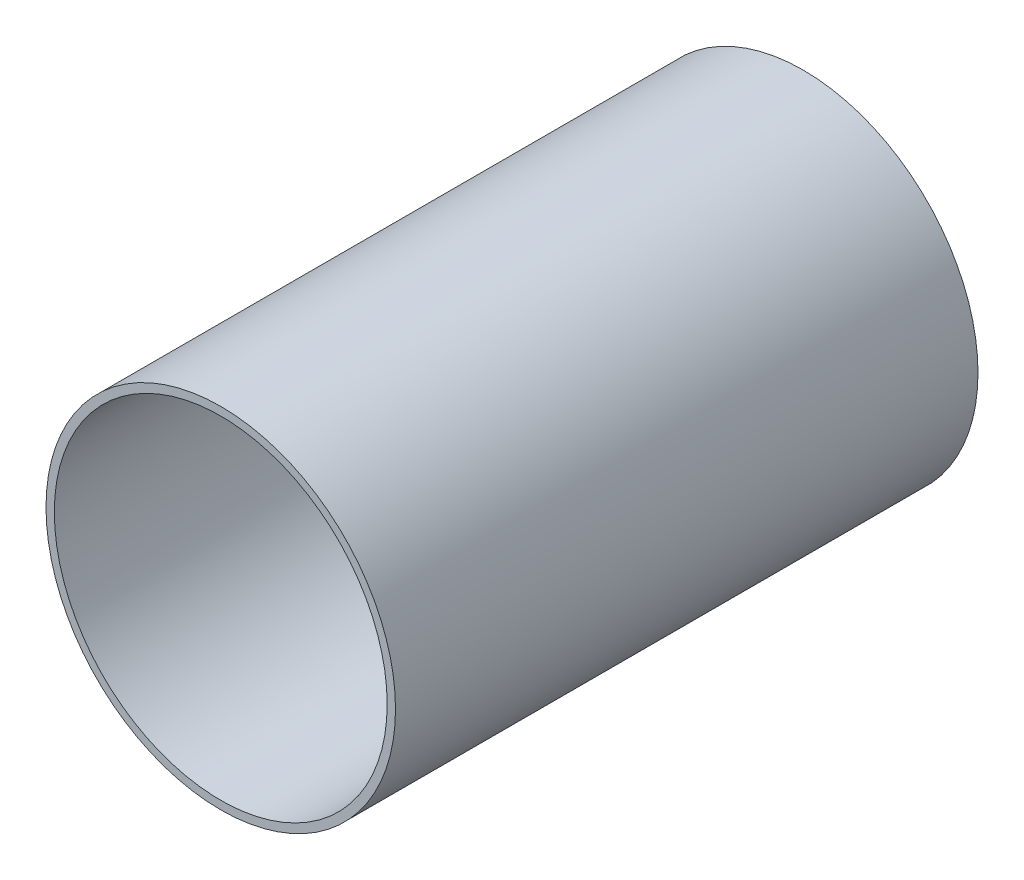
ISO-10303-21;
HEADER;
FILE_DESCRIPTION(('STEP AP214'),'2;1');
FILE_NAME('part.step','',(''),(''),'','','');
FILE_SCHEMA(('AUTOMOTIVE_DESIGN { 1 0 10303 214 1 1 1 1 }'));
ENDSEC;
DATA;
#1=APPLICATION_CONTEXT('core data for automotive mechanical design processes');
#2=APPLICATION_PROTOCOL_DEFINITION('international standard','automotive_design',2000,#1);
#3=PRODUCT_CONTEXT('',#1,'mechanical');
#4=PRODUCT('Part','Part','',(#3));
#5=PRODUCT_RELATED_PRODUCT_CATEGORY('part','',(#4));
#6=PRODUCT_DEFINITION_FORMATION('','',#4);
#7=PRODUCT_DEFINITION_CONTEXT('part definition',#1,'design');
#8=PRODUCT_DEFINITION('design','',#6,#7);
#9=PRODUCT_DEFINITION_SHAPE('','',#8);
#10=(LENGTH_UNIT() NAMED_UNIT(*) SI_UNIT(.MILLI.,.METRE.));
#11=(NAMED_UNIT(*) PLANE_ANGLE_UNIT() SI_UNIT($,.RADIAN.));
#12=(NAMED_UNIT(*) SI_UNIT($,.STERADIAN.) SOLID_ANGLE_UNIT());
#13=UNCERTAINTY_MEASURE_WITH_UNIT(LENGTH_MEASURE(1.E-05),#10,'distance_accuracy_value','');
#14=(GEOMETRIC_REPRESENTATION_CONTEXT(3) GLOBAL_UNCERTAINTY_ASSIGNED_CONTEXT((#13)) GLOBAL_UNIT_ASSIGNED_CONTEXT((#10,
#11,#12)) REPRESENTATION_CONTEXT('',''));
#15=CARTESIAN_POINT('',(0.,0.,0.));
#16=DIRECTION('',(0.,0.,1.));
#17=DIRECTION('',(1.,0.,0.));
#18=AXIS2_PLACEMENT_3D('',#15,#16,#17);
#19=CARTESIAN_POINT('',(0.,0.,70.));
#20=DIRECTION('',(0.,0.,1.));
#21=DIRECTION('',(1.,0.,0.));
#22=AXIS2_PLACEMENT_3D('',#19,#20,#21);
#23=PLANE('',#22);
#24=CARTESIAN_POINT('',(0.,0.,70.));
#25=DIRECTION('',(0.,0.,1.));
#26=DIRECTION('',(1.,0.,0.));
#27=AXIS2_PLACEMENT_3D('',#24,#25,#26);
#28=CIRCLE('',#27,21.);
#29=CARTESIAN_POINT('',(21.,0.,70.));
#30=VERTEX_POINT('',#29);
#31=EDGE_CURVE('E10',#30,#30,#28,.T.);
#32=ORIENTED_EDGE('',*,*,#31,.T.);
#33=EDGE_LOOP('',(#32));
#34=FACE_BOUND('',#33,.T.);
#35=CARTESIAN_POINT('',(0.,0.,70.));
#36=DIRECTION('',(0.,0.,1.));
#37=DIRECTION('',(1.,0.,0.));
#38=AXIS2_PLACEMENT_3D('',#35,#36,#37);
#39=CIRCLE('',#38,20.);
#40=CARTESIAN_POINT('',(20.,0.,70.));
#41=VERTEX_POINT('',#40);
#42=EDGE_CURVE('E57',#41,#41,#39,.T.);
#43=ORIENTED_EDGE('',*,*,#42,.F.);
#44=EDGE_LOOP('',(#43));
#45=FACE_BOUND('',#44,.T.);
#46=ADVANCED_FACE('F43',(#34,#45),#23,.T.);
#47=CARTESIAN_POINT('',(0.,0.,0.));
#48=DIRECTION('',(0.,0.,1.));
#49=DIRECTION('',(1.,0.,0.));
#50=AXIS2_PLACEMENT_3D('',#47,#48,#49);
#51=PLANE('',#50);
#52=CARTESIAN_POINT('',(0.,0.,0.));
#53=DIRECTION('',(0.,0.,1.));
#54=DIRECTION('',(1.,0.,0.));
#55=AXIS2_PLACEMENT_3D('',#52,#53,#54);
#56=CIRCLE('',#55,21.);
#57=CARTESIAN_POINT('',(21.,0.,0.));
#58=VERTEX_POINT('',#57);
#59=EDGE_CURVE('E48',#58,#58,#56,.T.);
#60=ORIENTED_EDGE('',*,*,#59,.F.);
#61=EDGE_LOOP('',(#60));
#62=FACE_BOUND('',#61,.T.);
#63=CARTESIAN_POINT('',(0.,0.,0.));
#64=DIRECTION('',(0.,0.,1.));
#65=DIRECTION('',(1.,0.,0.));
#66=AXIS2_PLACEMENT_3D('',#63,#64,#65);
#67=CIRCLE('',#66,20.);
#68=CARTESIAN_POINT('',(20.,0.,0.));
#69=VERTEX_POINT('',#68);
#70=EDGE_CURVE('E59',#69,#69,#67,.T.);
#71=ORIENTED_EDGE('',*,*,#70,.T.);
#72=EDGE_LOOP('',(#71));
#73=FACE_BOUND('',#72,.T.);
#74=ADVANCED_FACE('F71',(#62,#73),#51,.F.);
#75=CARTESIAN_POINT('',(0.,0.,70.));
#76=DIRECTION('',(0.,0.,-1.));
#77=DIRECTION('',(-1.,0.,0.));
#78=AXIS2_PLACEMENT_3D('',#75,#76,#77);
#79=CYLINDRICAL_SURFACE('',#78,21.);
#80=ORIENTED_EDGE('',*,*,#31,.F.);
#81=EDGE_LOOP('',(#80));
#82=FACE_BOUND('',#81,.T.);
#83=ORIENTED_EDGE('',*,*,#59,.T.);
#84=EDGE_LOOP('',(#83));
#85=FACE_BOUND('',#84,.T.);
#86=ADVANCED_FACE('F46',(#82,#85),#79,.T.);
#87=CARTESIAN_POINT('',(0.,0.,70.));
#88=DIRECTION('',(0.,0.,-1.));
#89=DIRECTION('',(-1.,0.,0.));
#90=AXIS2_PLACEMENT_3D('',#87,#88,#89);
#91=CYLINDRICAL_SURFACE('',#90,20.);
#92=ORIENTED_EDGE('',*,*,#42,.T.);
#93=EDGE_LOOP('',(#92));
#94=FACE_BOUND('',#93,.T.);
#95=ORIENTED_EDGE('',*,*,#70,.F.);
#96=EDGE_LOOP('',(#95));
#97=FACE_BOUND('',#96,.T.);
#98=ADVANCED_FACE('F67',(#94,#97),#91,.F.);
#99=CLOSED_SHELL('',(#46,#74,#86,#98));
#100=MANIFOLD_SOLID_BREP('B2',#99);
#101=ADVANCED_BREP_SHAPE_REPRESENTATION('',(#18,#100),#14);
#102=SHAPE_DEFINITION_REPRESENTATION(#9,#101);
ENDSEC;
END-ISO-10303-21;
